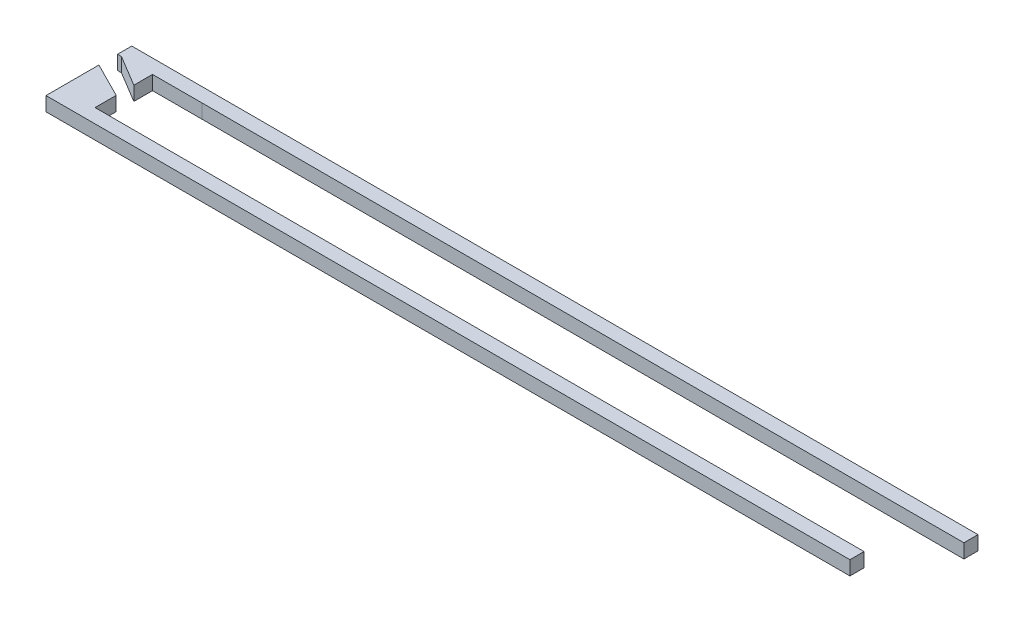
ISO-10303-21;
HEADER;
FILE_DESCRIPTION(('STEP AP214'),'2;1');
FILE_NAME('part.step','',(''),(''),'','','');
FILE_SCHEMA(('AUTOMOTIVE_DESIGN { 1 0 10303 214 1 1 1 1 }'));
ENDSEC;
DATA;
#1=APPLICATION_CONTEXT('core data for automotive mechanical design processes');
#2=APPLICATION_PROTOCOL_DEFINITION('international standard','automotive_design',2000,#1);
#3=PRODUCT_CONTEXT('',#1,'mechanical');
#4=PRODUCT('Part','Part','',(#3));
#5=PRODUCT_RELATED_PRODUCT_CATEGORY('part','',(#4));
#6=PRODUCT_DEFINITION_FORMATION('','',#4);
#7=PRODUCT_DEFINITION_CONTEXT('part definition',#1,'design');
#8=PRODUCT_DEFINITION('design','',#6,#7);
#9=PRODUCT_DEFINITION_SHAPE('','',#8);
#10=(LENGTH_UNIT() NAMED_UNIT(*) SI_UNIT(.MILLI.,.METRE.));
#11=(NAMED_UNIT(*) PLANE_ANGLE_UNIT() SI_UNIT($,.RADIAN.));
#12=(NAMED_UNIT(*) SI_UNIT($,.STERADIAN.) SOLID_ANGLE_UNIT());
#13=UNCERTAINTY_MEASURE_WITH_UNIT(LENGTH_MEASURE(1.E-05),#10,'distance_accuracy_value','');
#14=(GEOMETRIC_REPRESENTATION_CONTEXT(3) GLOBAL_UNCERTAINTY_ASSIGNED_CONTEXT((#13)) GLOBAL_UNIT_ASSIGNED_CONTEXT((#10,
#11,#12)) REPRESENTATION_CONTEXT('',''));
#15=CARTESIAN_POINT('',(0.,0.,0.));
#16=DIRECTION('',(0.,0.,1.));
#17=DIRECTION('',(1.,0.,0.));
#18=AXIS2_PLACEMENT_3D('',#15,#16,#17);
#19=CARTESIAN_POINT('',(-67.0737578050193,0.25,-3.84946644642149));
#20=DIRECTION('',(0.,0.,-1.));
#21=DIRECTION('',(-1.,0.,0.));
#22=AXIS2_PLACEMENT_3D('',#19,#20,#21);
#23=PLANE('',#22);
#24=DIRECTION('',(1.,0.,0.));
#25=VECTOR('',#24,1.);
#26=CARTESIAN_POINT('',(-67.0737578050193,-0.25,-3.84946644642149));
#27=LINE('',#26,#25);
#28=CARTESIAN_POINT('',(-70.0737578050193,-0.25,-3.84946644642149));
#29=VERTEX_POINT('',#28);
#30=CARTESIAN_POINT('',(-41.5737578050193,-0.25,-3.8494664464215));
#31=VERTEX_POINT('',#30);
#32=EDGE_CURVE('E69',#29,#31,#27,.T.);
#33=ORIENTED_EDGE('',*,*,#32,.T.);
#34=DIRECTION('',(0.,-1.,0.));
#35=VECTOR('',#34,1.);
#36=CARTESIAN_POINT('',(-41.5737578050193,0.25,-3.8494664464215));
#37=LINE('',#36,#35);
#38=CARTESIAN_POINT('',(-41.5737578050193,0.25,-3.8494664464215));
#39=VERTEX_POINT('',#38);
#40=EDGE_CURVE('E12',#39,#31,#37,.T.);
#41=ORIENTED_EDGE('',*,*,#40,.F.);
#42=DIRECTION('',(1.,0.,0.));
#43=VECTOR('',#42,1.);
#44=CARTESIAN_POINT('',(-67.0737578050193,0.25,-3.84946644642149));
#45=LINE('',#44,#43);
#46=CARTESIAN_POINT('',(-70.0737578050193,0.25,-3.84946644642149));
#47=VERTEX_POINT('',#46);
#48=EDGE_CURVE('E92',#47,#39,#45,.T.);
#49=ORIENTED_EDGE('',*,*,#48,.F.);
#50=DIRECTION('',(0.,1.,0.));
#51=VECTOR('',#50,1.);
#52=CARTESIAN_POINT('',(-70.0737578050193,-0.25,-3.84946644642149));
#53=LINE('',#52,#51);
#54=EDGE_CURVE('E135',#29,#47,#53,.T.);
#55=ORIENTED_EDGE('',*,*,#54,.F.);
#56=EDGE_LOOP('',(#33,#41,#49,#55));
#57=FACE_BOUND('',#56,.T.);
#58=ADVANCED_FACE('F42',(#57),#23,.F.);
#59=CARTESIAN_POINT('',(-41.5737578050193,0.25,-4.34946644642147));
#60=DIRECTION('',(-1.,0.,0.));
#61=DIRECTION('',(0.,0.,1.));
#62=AXIS2_PLACEMENT_3D('',#59,#60,#61);
#63=PLANE('',#62);
#64=DIRECTION('',(0.,0.,-1.));
#65=VECTOR('',#64,1.);
#66=CARTESIAN_POINT('',(-41.5737578050193,-0.25,-4.34946644642147));
#67=LINE('',#66,#65);
#68=CARTESIAN_POINT('',(-41.5737578050193,-0.25,-4.34946644642147));
#69=VERTEX_POINT('',#68);
#70=EDGE_CURVE('E144',#31,#69,#67,.T.);
#71=ORIENTED_EDGE('',*,*,#70,.T.);
#72=DIRECTION('',(0.,-1.,0.));
#73=VECTOR('',#72,1.);
#74=CARTESIAN_POINT('',(-41.5737578050193,0.25,-4.34946644642147));
#75=LINE('',#74,#73);
#76=CARTESIAN_POINT('',(-41.5737578050193,0.25,-4.34946644642147));
#77=VERTEX_POINT('',#76);
#78=EDGE_CURVE('E50',#77,#69,#75,.T.);
#79=ORIENTED_EDGE('',*,*,#78,.F.);
#80=DIRECTION('',(0.,0.,-1.));
#81=VECTOR('',#80,1.);
#82=CARTESIAN_POINT('',(-41.5737578050193,0.25,-4.34946644642147));
#83=LINE('',#82,#81);
#84=EDGE_CURVE('E58',#39,#77,#83,.T.);
#85=ORIENTED_EDGE('',*,*,#84,.F.);
#86=ORIENTED_EDGE('',*,*,#40,.T.);
#87=EDGE_LOOP('',(#71,#79,#85,#86));
#88=FACE_BOUND('',#87,.T.);
#89=ADVANCED_FACE('F149',(#88),#63,.F.);
#90=CARTESIAN_POINT('',(-67.0737578050193,0.25,-4.34946644642147));
#91=DIRECTION('',(0.,0.,1.));
#92=DIRECTION('',(1.,0.,0.));
#93=AXIS2_PLACEMENT_3D('',#90,#91,#92);
#94=PLANE('',#93);
#95=DIRECTION('',(-1.,0.,0.));
#96=VECTOR('',#95,1.);
#97=CARTESIAN_POINT('',(-67.0737578050193,-0.25,-4.34946644642147));
#98=LINE('',#97,#96);
#99=CARTESIAN_POINT('',(-68.8350219290469,-0.25,-4.34946644642149));
#100=VERTEX_POINT('',#99);
#101=EDGE_CURVE('E100',#69,#100,#98,.T.);
#102=ORIENTED_EDGE('',*,*,#101,.T.);
#103=DIRECTION('',(0.,1.,0.));
#104=VECTOR('',#103,1.);
#105=CARTESIAN_POINT('',(-68.8350219290469,-0.25,-4.34946644642149));
#106=LINE('',#105,#104);
#107=CARTESIAN_POINT('',(-68.8350219290469,0.25,-4.34946644642149));
#108=VERTEX_POINT('',#107);
#109=EDGE_CURVE('E118',#100,#108,#106,.T.);
#110=ORIENTED_EDGE('',*,*,#109,.T.);
#111=DIRECTION('',(-1.,0.,0.));
#112=VECTOR('',#111,1.);
#113=CARTESIAN_POINT('',(-67.0737578050193,0.25,-4.34946644642147));
#114=LINE('',#113,#112);
#115=EDGE_CURVE('E141',#77,#108,#114,.T.);
#116=ORIENTED_EDGE('',*,*,#115,.F.);
#117=ORIENTED_EDGE('',*,*,#78,.T.);
#118=EDGE_LOOP('',(#102,#110,#116,#117));
#119=FACE_BOUND('',#118,.T.);
#120=ADVANCED_FACE('F147',(#119),#94,.F.);
#121=CARTESIAN_POINT('',(0.,0.25,0.));
#122=DIRECTION('',(0.,1.,0.));
#123=DIRECTION('',(0.,0.,1.));
#124=AXIS2_PLACEMENT_3D('',#121,#122,#123);
#125=PLANE('',#124);
#126=ORIENTED_EDGE('',*,*,#115,.T.);
#127=DIRECTION('',(0.,0.,-1.));
#128=VECTOR('',#127,1.);
#129=CARTESIAN_POINT('',(-68.8350219290469,0.25,-4.34946644642149));
#130=LINE('',#129,#128);
#131=CARTESIAN_POINT('',(-68.8350219290469,0.25,-5.09946644642149));
#132=VERTEX_POINT('',#131);
#133=EDGE_CURVE('E132',#108,#132,#130,.T.);
#134=ORIENTED_EDGE('',*,*,#133,.T.);
#135=DIRECTION('',(-0.892654247793029,0.,-0.450742048068584));
#136=VECTOR('',#135,1.);
#137=CARTESIAN_POINT('',(-68.8350219290469,0.25,-5.09946644642149));
#138=LINE('',#137,#136);
#139=CARTESIAN_POINT('',(-70.0737578050193,0.25,-5.72496097258579));
#140=VERTEX_POINT('',#139);
#141=EDGE_CURVE('E112',#132,#140,#138,.T.);
#142=ORIENTED_EDGE('',*,*,#141,.T.);
#143=DIRECTION('',(0.,0.,1.));
#144=VECTOR('',#143,1.);
#145=CARTESIAN_POINT('',(-70.0737578050193,0.25,-3.84946644642149));
#146=LINE('',#145,#144);
#147=EDGE_CURVE('E126',#140,#47,#146,.T.);
#148=ORIENTED_EDGE('',*,*,#147,.T.);
#149=ORIENTED_EDGE('',*,*,#48,.T.);
#150=ORIENTED_EDGE('',*,*,#84,.T.);
#151=EDGE_LOOP('',(#126,#134,#142,#148,#149,#150));
#152=FACE_BOUND('',#151,.T.);
#153=ADVANCED_FACE('F157',(#152),#125,.T.);
#154=CARTESIAN_POINT('',(0.,-0.25,0.));
#155=DIRECTION('',(0.,1.,0.));
#156=DIRECTION('',(0.,0.,1.));
#157=AXIS2_PLACEMENT_3D('',#154,#155,#156);
#158=PLANE('',#157);
#159=ORIENTED_EDGE('',*,*,#32,.F.);
#160=DIRECTION('',(0.,0.,1.));
#161=VECTOR('',#160,1.);
#162=CARTESIAN_POINT('',(-70.0737578050193,-0.25,-5.72496097258579));
#163=LINE('',#162,#161);
#164=CARTESIAN_POINT('',(-70.0737578050193,-0.25,-5.72496097258579));
#165=VERTEX_POINT('',#164);
#166=EDGE_CURVE('E123',#165,#29,#163,.T.);
#167=ORIENTED_EDGE('',*,*,#166,.F.);
#168=DIRECTION('',(-0.892654247793029,0.,-0.450742048068584));
#169=VECTOR('',#168,1.);
#170=CARTESIAN_POINT('',(-68.8350219290469,-0.25,-5.09946644642149));
#171=LINE('',#170,#169);
#172=CARTESIAN_POINT('',(-68.8350219290469,-0.25,-5.09946644642149));
#173=VERTEX_POINT('',#172);
#174=EDGE_CURVE('E110',#173,#165,#171,.T.);
#175=ORIENTED_EDGE('',*,*,#174,.F.);
#176=DIRECTION('',(0.,0.,-1.));
#177=VECTOR('',#176,1.);
#178=CARTESIAN_POINT('',(-68.8350219290469,-0.25,-4.34946644642149));
#179=LINE('',#178,#177);
#180=EDGE_CURVE('E122',#100,#173,#179,.T.);
#181=ORIENTED_EDGE('',*,*,#180,.F.);
#182=ORIENTED_EDGE('',*,*,#101,.F.);
#183=ORIENTED_EDGE('',*,*,#70,.F.);
#184=EDGE_LOOP('',(#159,#167,#175,#181,#182,#183));
#185=FACE_BOUND('',#184,.T.);
#186=ADVANCED_FACE('F121',(#185),#158,.F.);
#187=CARTESIAN_POINT('',(-70.0737578050193,-0.25,-3.84946644642149));
#188=DIRECTION('',(-1.,0.,0.));
#189=DIRECTION('',(0.,0.,1.));
#190=AXIS2_PLACEMENT_3D('',#187,#188,#189);
#191=PLANE('',#190);
#192=ORIENTED_EDGE('',*,*,#147,.F.);
#193=DIRECTION('',(0.,1.,0.));
#194=VECTOR('',#193,1.);
#195=CARTESIAN_POINT('',(-70.0737578050193,-0.25,-5.72496097258579));
#196=LINE('',#195,#194);
#197=EDGE_CURVE('E117',#165,#140,#196,.T.);
#198=ORIENTED_EDGE('',*,*,#197,.F.);
#199=ORIENTED_EDGE('',*,*,#166,.T.);
#200=ORIENTED_EDGE('',*,*,#54,.T.);
#201=EDGE_LOOP('',(#192,#198,#199,#200));
#202=FACE_BOUND('',#201,.T.);
#203=ADVANCED_FACE('F162',(#202),#191,.T.);
#204=CARTESIAN_POINT('',(-68.8350219290469,-0.25,-5.09946644642149));
#205=DIRECTION('',(0.450742048068584,0.,-0.892654247793029));
#206=DIRECTION('',(-0.892654247793029,0.,-0.450742048068584));
#207=AXIS2_PLACEMENT_3D('',#204,#205,#206);
#208=PLANE('',#207);
#209=ORIENTED_EDGE('',*,*,#141,.F.);
#210=DIRECTION('',(0.,1.,0.));
#211=VECTOR('',#210,1.);
#212=CARTESIAN_POINT('',(-68.8350219290469,-0.25,-5.09946644642149));
#213=LINE('',#212,#211);
#214=EDGE_CURVE('E106',#173,#132,#213,.T.);
#215=ORIENTED_EDGE('',*,*,#214,.F.);
#216=ORIENTED_EDGE('',*,*,#174,.T.);
#217=ORIENTED_EDGE('',*,*,#197,.T.);
#218=EDGE_LOOP('',(#209,#215,#216,#217));
#219=FACE_BOUND('',#218,.T.);
#220=ADVANCED_FACE('F108',(#219),#208,.T.);
#221=CARTESIAN_POINT('',(-68.8350219290469,-0.25,-4.34946644642149));
#222=DIRECTION('',(1.,0.,0.));
#223=DIRECTION('',(0.,0.,-1.));
#224=AXIS2_PLACEMENT_3D('',#221,#222,#223);
#225=PLANE('',#224);
#226=ORIENTED_EDGE('',*,*,#133,.F.);
#227=ORIENTED_EDGE('',*,*,#109,.F.);
#228=ORIENTED_EDGE('',*,*,#180,.T.);
#229=ORIENTED_EDGE('',*,*,#214,.T.);
#230=EDGE_LOOP('',(#226,#227,#228,#229));
#231=FACE_BOUND('',#230,.T.);
#232=ADVANCED_FACE('F125',(#231),#225,.T.);
#233=CLOSED_SHELL('',(#58,#89,#120,#153,#186,#203,#220,#232));
#234=MANIFOLD_SOLID_BREP('B2',#233);
#235=CARTESIAN_POINT('',(-67.0737578050193,0.25,-6.38946644642147));
#236=DIRECTION('',(0.,0.,-1.));
#237=DIRECTION('',(-1.,0.,0.));
#238=AXIS2_PLACEMENT_3D('',#235,#236,#237);
#239=PLANE('',#238);
#240=DIRECTION('',(1.,0.,0.));
#241=VECTOR('',#240,1.);
#242=CARTESIAN_POINT('',(-67.0737578050193,-0.25,-6.38946644642147));
#243=LINE('',#242,#241);
#244=CARTESIAN_POINT('',(-67.0737578050193,-0.25,-6.38771214846168));
#245=VERTEX_POINT('',#244);
#246=CARTESIAN_POINT('',(-40.0737578050193,-0.25,-6.38946644642147));
#247=VERTEX_POINT('',#246);
#248=EDGE_CURVE('E266',#245,#247,#243,.T.);
#249=ORIENTED_EDGE('',*,*,#248,.T.);
#250=DIRECTION('',(0.,-1.,0.));
#251=VECTOR('',#250,1.);
#252=CARTESIAN_POINT('',(-40.0737578050193,0.25,-6.38946644642147));
#253=LINE('',#252,#251);
#254=CARTESIAN_POINT('',(-40.0737578050193,0.25,-6.38946644642147));
#255=VERTEX_POINT('',#254);
#256=EDGE_CURVE('E245',#255,#247,#253,.T.);
#257=ORIENTED_EDGE('',*,*,#256,.F.);
#258=DIRECTION('',(1.,0.,0.));
#259=VECTOR('',#258,1.);
#260=CARTESIAN_POINT('',(-67.0737578050193,0.25,-6.38946644642147));
#261=LINE('',#260,#259);
#262=CARTESIAN_POINT('',(-67.0737578050193,0.25,-6.38771214846168));
#263=VERTEX_POINT('',#262);
#264=EDGE_CURVE('E274',#263,#255,#261,.T.);
#265=ORIENTED_EDGE('',*,*,#264,.F.);
#266=CARTESIAN_POINT('',(-67.0737578050193,0.25,-6.38946644642147));
#267=DIRECTION('',(0.,-1.,0.));
#268=VECTOR('',#267,1.);
#269=LINE('',#266,#268);
#270=EDGE_CURVE('E40',#263,#245,#269,.T.);
#271=ORIENTED_EDGE('',*,*,#270,.T.);
#272=EDGE_LOOP('',(#249,#257,#265,#271));
#273=FACE_BOUND('',#272,.T.);
#274=ADVANCED_FACE('F235',(#273),#239,.F.);
#275=CARTESIAN_POINT('',(-40.0737578050193,0.25,-6.88946644642147));
#276=DIRECTION('',(-1.,0.,0.));
#277=DIRECTION('',(0.,0.,1.));
#278=AXIS2_PLACEMENT_3D('',#275,#276,#277);
#279=PLANE('',#278);
#280=DIRECTION('',(0.,0.,-1.));
#281=VECTOR('',#280,1.);
#282=CARTESIAN_POINT('',(-40.0737578050193,-0.25,-6.88946644642147));
#283=LINE('',#282,#281);
#284=CARTESIAN_POINT('',(-40.0737578050193,-0.25,-6.88946644642147));
#285=VERTEX_POINT('',#284);
#286=EDGE_CURVE('E271',#247,#285,#283,.T.);
#287=ORIENTED_EDGE('',*,*,#286,.T.);
#288=DIRECTION('',(0.,-1.,0.));
#289=VECTOR('',#288,1.);
#290=CARTESIAN_POINT('',(-40.0737578050193,0.25,-6.88946644642147));
#291=LINE('',#290,#289);
#292=CARTESIAN_POINT('',(-40.0737578050193,0.25,-6.88946644642147));
#293=VERTEX_POINT('',#292);
#294=EDGE_CURVE('E313',#293,#285,#291,.T.);
#295=ORIENTED_EDGE('',*,*,#294,.F.);
#296=DIRECTION('',(0.,0.,-1.));
#297=VECTOR('',#296,1.);
#298=CARTESIAN_POINT('',(-40.0737578050193,0.25,-6.88946644642147));
#299=LINE('',#298,#297);
#300=EDGE_CURVE('E253',#255,#293,#299,.T.);
#301=ORIENTED_EDGE('',*,*,#300,.F.);
#302=ORIENTED_EDGE('',*,*,#256,.T.);
#303=EDGE_LOOP('',(#287,#295,#301,#302));
#304=FACE_BOUND('',#303,.T.);
#305=ADVANCED_FACE('F398',(#304),#279,.F.);
#306=CARTESIAN_POINT('',(-67.0737578050193,0.25,-6.88946644642147));
#307=DIRECTION('',(0.,0.,1.));
#308=DIRECTION('',(1.,0.,0.));
#309=AXIS2_PLACEMENT_3D('',#306,#307,#308);
#310=PLANE('',#309);
#311=DIRECTION('',(-1.,0.,0.));
#312=VECTOR('',#311,1.);
#313=CARTESIAN_POINT('',(-67.0737578050193,-0.25,-6.88946644642147));
#314=LINE('',#313,#312);
#315=CARTESIAN_POINT('',(-70.0737578050193,-0.25,-6.88946644642147));
#316=VERTEX_POINT('',#315);
#317=EDGE_CURVE('E307',#285,#316,#314,.T.);
#318=ORIENTED_EDGE('',*,*,#317,.T.);
#319=DIRECTION('',(0.,1.,0.));
#320=VECTOR('',#319,1.);
#321=CARTESIAN_POINT('',(-70.0737578050193,-0.25,-6.88946644642147));
#322=LINE('',#321,#320);
#323=CARTESIAN_POINT('',(-70.0737578050193,0.25,-6.88946644642147));
#324=VERTEX_POINT('',#323);
#325=EDGE_CURVE('E311',#316,#324,#322,.T.);
#326=ORIENTED_EDGE('',*,*,#325,.T.);
#327=DIRECTION('',(-1.,0.,0.));
#328=VECTOR('',#327,1.);
#329=CARTESIAN_POINT('',(-67.0737578050193,0.25,-6.88946644642147));
#330=LINE('',#329,#328);
#331=EDGE_CURVE('E470',#293,#324,#330,.T.);
#332=ORIENTED_EDGE('',*,*,#331,.F.);
#333=ORIENTED_EDGE('',*,*,#294,.T.);
#334=EDGE_LOOP('',(#318,#326,#332,#333));
#335=FACE_BOUND('',#334,.T.);
#336=ADVANCED_FACE('F309',(#335),#310,.F.);
#337=CARTESIAN_POINT('',(0.,0.25,0.));
#338=DIRECTION('',(0.,1.,0.));
#339=DIRECTION('',(0.,0.,1.));
#340=AXIS2_PLACEMENT_3D('',#337,#338,#339);
#341=PLANE('',#340);
#342=ORIENTED_EDGE('',*,*,#331,.T.);
#343=DIRECTION('',(0.,0.,1.));
#344=VECTOR('',#343,1.);
#345=CARTESIAN_POINT('',(-70.0737578050193,0.25,-6.88946644642147));
#346=LINE('',#345,#344);
#347=CARTESIAN_POINT('',(-70.0737578050193,0.25,-6.38595785050189));
#348=VERTEX_POINT('',#347);
#349=EDGE_CURVE('E322',#324,#348,#346,.T.);
#350=ORIENTED_EDGE('',*,*,#349,.T.);
#351=DIRECTION('',(1.,0.,0.));
#352=VECTOR('',#351,1.);
#353=CARTESIAN_POINT('',(-69.9362513124839,0.25,-6.38595785050189));
#354=LINE('',#353,#352);
#355=CARTESIAN_POINT('',(-69.9362513124839,0.25,-6.38595785050189));
#356=VERTEX_POINT('',#355);
#357=EDGE_CURVE('E345',#348,#356,#354,.T.);
#358=ORIENTED_EDGE('',*,*,#357,.T.);
#359=DIRECTION('',(0.857403862615544,0.,0.514644164808992));
#360=VECTOR('',#359,1.);
#361=CARTESIAN_POINT('',(-69.9362513124839,0.25,-6.38595785050189));
#362=LINE('',#361,#360);
#363=CARTESIAN_POINT('',(-68.8350219290469,0.25,-5.72496097258579));
#364=VERTEX_POINT('',#363);
#365=EDGE_CURVE('E348',#356,#364,#362,.T.);
#366=ORIENTED_EDGE('',*,*,#365,.T.);
#367=DIRECTION('',(0.,0.,-1.));
#368=VECTOR('',#367,1.);
#369=CARTESIAN_POINT('',(-68.8350219290469,0.25,-5.72496097258579));
#370=LINE('',#369,#368);
#371=CARTESIAN_POINT('',(-68.8350219290469,0.25,-6.38595785050189));
#372=VERTEX_POINT('',#371);
#373=EDGE_CURVE('E336',#364,#372,#370,.T.);
#374=ORIENTED_EDGE('',*,*,#373,.T.);
#375=DIRECTION('',(1.,0.,0.));
#376=VECTOR('',#375,1.);
#377=CARTESIAN_POINT('',(-67.0737578050193,0.25,-6.38595785050189));
#378=LINE('',#377,#376);
#379=EDGE_CURVE('E331',#372,#263,#378,.T.);
#380=ORIENTED_EDGE('',*,*,#379,.T.);
#381=ORIENTED_EDGE('',*,*,#264,.T.);
#382=ORIENTED_EDGE('',*,*,#300,.T.);
#383=EDGE_LOOP('',(#342,#350,#358,#366,#374,#380,#381,#382));
#384=FACE_BOUND('',#383,.T.);
#385=ADVANCED_FACE('F392',(#384),#341,.T.);
#386=CARTESIAN_POINT('',(0.,-0.25,0.));
#387=DIRECTION('',(0.,1.,0.));
#388=DIRECTION('',(0.,0.,1.));
#389=AXIS2_PLACEMENT_3D('',#386,#387,#388);
#390=PLANE('',#389);
#391=ORIENTED_EDGE('',*,*,#248,.F.);
#392=DIRECTION('',(1.,0.,0.));
#393=VECTOR('',#392,1.);
#394=CARTESIAN_POINT('',(-67.0737578050193,-0.25,-6.38595785050189));
#395=LINE('',#394,#393);
#396=CARTESIAN_POINT('',(-68.8350219290469,-0.25,-6.38595785050189));
#397=VERTEX_POINT('',#396);
#398=EDGE_CURVE('E324',#397,#245,#395,.T.);
#399=ORIENTED_EDGE('',*,*,#398,.F.);
#400=DIRECTION('',(0.,0.,-1.));
#401=VECTOR('',#400,1.);
#402=CARTESIAN_POINT('',(-68.8350219290469,-0.25,-5.72496097258579));
#403=LINE('',#402,#401);
#404=CARTESIAN_POINT('',(-68.8350219290469,-0.25,-5.72496097258579));
#405=VERTEX_POINT('',#404);
#406=EDGE_CURVE('E341',#405,#397,#403,.T.);
#407=ORIENTED_EDGE('',*,*,#406,.F.);
#408=DIRECTION('',(0.857403862615544,0.,0.514644164808992));
#409=VECTOR('',#408,1.);
#410=CARTESIAN_POINT('',(-69.9362513124839,-0.25,-6.38595785050189));
#411=LINE('',#410,#409);
#412=CARTESIAN_POINT('',(-69.9362513124839,-0.25,-6.38595785050189));
#413=VERTEX_POINT('',#412);
#414=EDGE_CURVE('E333',#413,#405,#411,.T.);
#415=ORIENTED_EDGE('',*,*,#414,.F.);
#416=DIRECTION('',(1.,0.,0.));
#417=VECTOR('',#416,1.);
#418=CARTESIAN_POINT('',(-69.9362513124839,-0.25,-6.38595785050189));
#419=LINE('',#418,#417);
#420=CARTESIAN_POINT('',(-70.0737578050193,-0.25,-6.38595785050189));
#421=VERTEX_POINT('',#420);
#422=EDGE_CURVE('E330',#421,#413,#419,.T.);
#423=ORIENTED_EDGE('',*,*,#422,.F.);
#424=DIRECTION('',(0.,0.,1.));
#425=VECTOR('',#424,1.);
#426=CARTESIAN_POINT('',(-70.0737578050193,-0.25,-6.88946644642147));
#427=LINE('',#426,#425);
#428=EDGE_CURVE('E320',#316,#421,#427,.T.);
#429=ORIENTED_EDGE('',*,*,#428,.F.);
#430=ORIENTED_EDGE('',*,*,#317,.F.);
#431=ORIENTED_EDGE('',*,*,#286,.F.);
#432=EDGE_LOOP('',(#391,#399,#407,#415,#423,#429,#430,#431));
#433=FACE_BOUND('',#432,.T.);
#434=ADVANCED_FACE('F327',(#433),#390,.F.);
#435=CARTESIAN_POINT('',(-67.0737578050193,-0.25,-6.38595785050189));
#436=DIRECTION('',(0.,0.,1.));
#437=DIRECTION('',(1.,0.,0.));
#438=AXIS2_PLACEMENT_3D('',#435,#436,#437);
#439=PLANE('',#438);
#440=ORIENTED_EDGE('',*,*,#379,.F.);
#441=DIRECTION('',(0.,1.,0.));
#442=VECTOR('',#441,1.);
#443=CARTESIAN_POINT('',(-68.8350219290469,-0.25,-6.38595785050189));
#444=LINE('',#443,#442);
#445=EDGE_CURVE('E353',#397,#372,#444,.T.);
#446=ORIENTED_EDGE('',*,*,#445,.F.);
#447=ORIENTED_EDGE('',*,*,#398,.T.);
#448=ORIENTED_EDGE('',*,*,#270,.F.);
#449=EDGE_LOOP('',(#440,#446,#447,#448));
#450=FACE_BOUND('',#449,.T.);
#451=ADVANCED_FACE('F369',(#450),#439,.T.);
#452=CARTESIAN_POINT('',(-68.8350219290469,-0.25,-5.72496097258579));
#453=DIRECTION('',(1.,0.,0.));
#454=DIRECTION('',(0.,0.,-1.));
#455=AXIS2_PLACEMENT_3D('',#452,#453,#454);
#456=PLANE('',#455);
#457=ORIENTED_EDGE('',*,*,#373,.F.);
#458=DIRECTION('',(0.,1.,0.));
#459=VECTOR('',#458,1.);
#460=CARTESIAN_POINT('',(-68.8350219290469,-0.25,-5.72496097258579));
#461=LINE('',#460,#459);
#462=EDGE_CURVE('E355',#405,#364,#461,.T.);
#463=ORIENTED_EDGE('',*,*,#462,.F.);
#464=ORIENTED_EDGE('',*,*,#406,.T.);
#465=ORIENTED_EDGE('',*,*,#445,.T.);
#466=EDGE_LOOP('',(#457,#463,#464,#465));
#467=FACE_BOUND('',#466,.T.);
#468=ADVANCED_FACE('F378',(#467),#456,.T.);
#469=CARTESIAN_POINT('',(-69.9362513124839,-0.25,-6.38595785050189));
#470=DIRECTION('',(-0.514644164808992,0.,0.857403862615544));
#471=DIRECTION('',(0.857403862615544,0.,0.514644164808992));
#472=AXIS2_PLACEMENT_3D('',#469,#470,#471);
#473=PLANE('',#472);
#474=ORIENTED_EDGE('',*,*,#365,.F.);
#475=DIRECTION('',(0.,1.,0.));
#476=VECTOR('',#475,1.);
#477=CARTESIAN_POINT('',(-69.9362513124839,-0.25,-6.38595785050189));
#478=LINE('',#477,#476);
#479=EDGE_CURVE('E357',#413,#356,#478,.T.);
#480=ORIENTED_EDGE('',*,*,#479,.F.);
#481=ORIENTED_EDGE('',*,*,#414,.T.);
#482=ORIENTED_EDGE('',*,*,#462,.T.);
#483=EDGE_LOOP('',(#474,#480,#481,#482));
#484=FACE_BOUND('',#483,.T.);
#485=ADVANCED_FACE('F381',(#484),#473,.T.);
#486=CARTESIAN_POINT('',(-69.9362513124839,-0.25,-6.38595785050189));
#487=DIRECTION('',(0.,0.,1.));
#488=DIRECTION('',(1.,0.,0.));
#489=AXIS2_PLACEMENT_3D('',#486,#487,#488);
#490=PLANE('',#489);
#491=ORIENTED_EDGE('',*,*,#357,.F.);
#492=DIRECTION('',(0.,1.,0.));
#493=VECTOR('',#492,1.);
#494=CARTESIAN_POINT('',(-70.0737578050193,-0.25,-6.38595785050189));
#495=LINE('',#494,#493);
#496=EDGE_CURVE('E323',#421,#348,#495,.T.);
#497=ORIENTED_EDGE('',*,*,#496,.F.);
#498=ORIENTED_EDGE('',*,*,#422,.T.);
#499=ORIENTED_EDGE('',*,*,#479,.T.);
#500=EDGE_LOOP('',(#491,#497,#498,#499));
#501=FACE_BOUND('',#500,.T.);
#502=ADVANCED_FACE('F385',(#501),#490,.T.);
#503=CARTESIAN_POINT('',(-70.0737578050193,-0.25,-6.88946644642147));
#504=DIRECTION('',(-1.,0.,0.));
#505=DIRECTION('',(0.,0.,1.));
#506=AXIS2_PLACEMENT_3D('',#503,#504,#505);
#507=PLANE('',#506);
#508=ORIENTED_EDGE('',*,*,#349,.F.);
#509=ORIENTED_EDGE('',*,*,#325,.F.);
#510=ORIENTED_EDGE('',*,*,#428,.T.);
#511=ORIENTED_EDGE('',*,*,#496,.T.);
#512=EDGE_LOOP('',(#508,#509,#510,#511));
#513=FACE_BOUND('',#512,.T.);
#514=ADVANCED_FACE('F319',(#513),#507,.T.);
#515=CLOSED_SHELL('',(#274,#305,#336,#385,#434,#451,#468,#485,#502,#514));
#516=MANIFOLD_SOLID_BREP('B6',#515);
#517=ADVANCED_BREP_SHAPE_REPRESENTATION('',(#18,#234,#516),#14);
#518=SHAPE_DEFINITION_REPRESENTATION(#9,#517);
ENDSEC;
END-ISO-10303-21;
